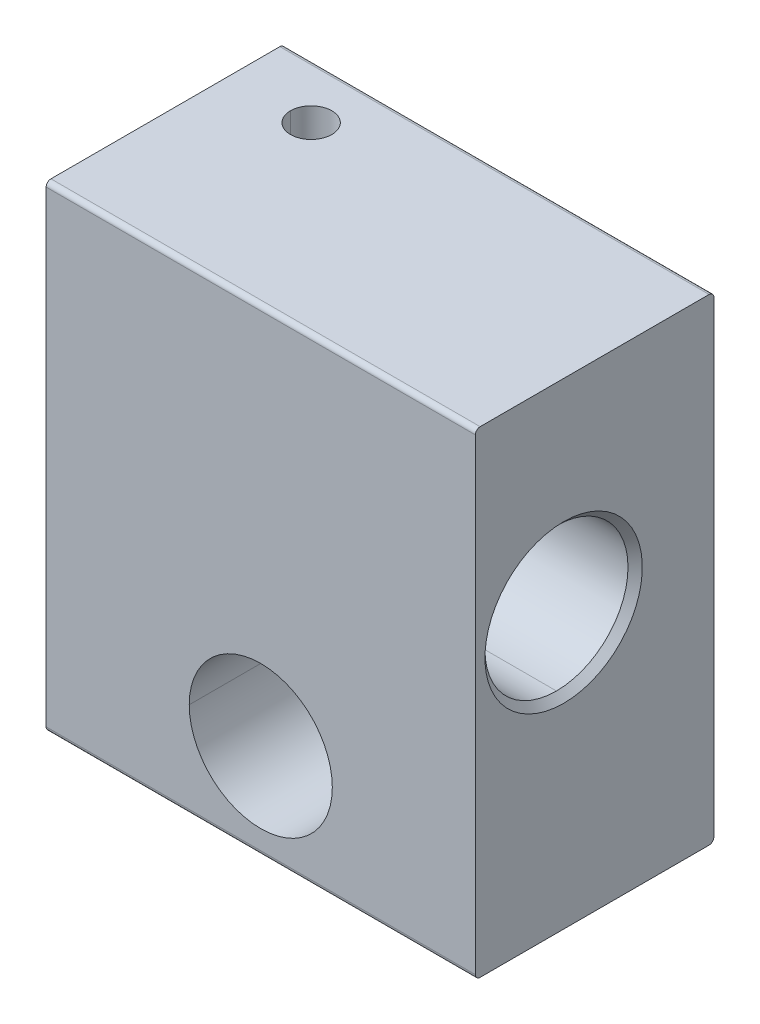
ISO-10303-21;
HEADER;
FILE_DESCRIPTION(('STEP AP214'),'2;1');
FILE_NAME('part.step','',(''),(''),'','','');
FILE_SCHEMA(('AUTOMOTIVE_DESIGN { 1 0 10303 214 1 1 1 1 }'));
ENDSEC;
DATA;
#1=APPLICATION_CONTEXT('core data for automotive mechanical design processes');
#2=APPLICATION_PROTOCOL_DEFINITION('international standard','automotive_design',2000,#1);
#3=PRODUCT_CONTEXT('',#1,'mechanical');
#4=PRODUCT('Part','Part','',(#3));
#5=PRODUCT_RELATED_PRODUCT_CATEGORY('part','',(#4));
#6=PRODUCT_DEFINITION_FORMATION('','',#4);
#7=PRODUCT_DEFINITION_CONTEXT('part definition',#1,'design');
#8=PRODUCT_DEFINITION('design','',#6,#7);
#9=PRODUCT_DEFINITION_SHAPE('','',#8);
#10=(LENGTH_UNIT() NAMED_UNIT(*) SI_UNIT(.MILLI.,.METRE.));
#11=(NAMED_UNIT(*) PLANE_ANGLE_UNIT() SI_UNIT($,.RADIAN.));
#12=(NAMED_UNIT(*) SI_UNIT($,.STERADIAN.) SOLID_ANGLE_UNIT());
#13=UNCERTAINTY_MEASURE_WITH_UNIT(LENGTH_MEASURE(1.E-05),#10,'distance_accuracy_value','');
#14=(GEOMETRIC_REPRESENTATION_CONTEXT(3) GLOBAL_UNCERTAINTY_ASSIGNED_CONTEXT((#13)) GLOBAL_UNIT_ASSIGNED_CONTEXT((#10,
#11,#12)) REPRESENTATION_CONTEXT('',''));
#15=CARTESIAN_POINT('',(0.,0.,0.));
#16=DIRECTION('',(0.,0.,1.));
#17=DIRECTION('',(1.,0.,0.));
#18=AXIS2_PLACEMENT_3D('',#15,#16,#17);
#19=CARTESIAN_POINT('',(0.,0.,0.));
#20=DIRECTION('',(-1.,0.,0.));
#21=DIRECTION('',(0.,0.,1.));
#22=AXIS2_PLACEMENT_3D('',#19,#20,#21);
#23=PLANE('',#22);
#24=CARTESIAN_POINT('',(0.,4.75,-2.75));
#25=DIRECTION('',(-1.,0.,0.));
#26=DIRECTION('',(0.,0.,1.));
#27=AXIS2_PLACEMENT_3D('',#24,#25,#26);
#28=CIRCLE('',#27,1.75);
#29=CARTESIAN_POINT('',(0.,3.,-2.75));
#30=VERTEX_POINT('',#29);
#31=CARTESIAN_POINT('',(0.,6.5,-2.75));
#32=VERTEX_POINT('',#31);
#33=EDGE_CURVE('E94',#30,#32,#28,.T.);
#34=ORIENTED_EDGE('',*,*,#33,.T.);
#35=CARTESIAN_POINT('',(0.,4.75,-2.75));
#36=DIRECTION('',(-1.,0.,0.));
#37=DIRECTION('',(0.,0.,1.));
#38=AXIS2_PLACEMENT_3D('',#35,#36,#37);
#39=CIRCLE('',#38,1.75);
#40=EDGE_CURVE('E19',#32,#30,#39,.T.);
#41=ORIENTED_EDGE('',*,*,#40,.T.);
#42=EDGE_LOOP('',(#34,#41));
#43=FACE_BOUND('',#42,.T.);
#44=ADVANCED_FACE('F16',(#43),#23,.T.);
#45=CARTESIAN_POINT('',(-5.58374404907,8.5,-2.69599699974));
#46=DIRECTION('',(0.,1.,0.));
#47=DIRECTION('',(0.,0.,1.));
#48=AXIS2_PLACEMENT_3D('',#45,#46,#47);
#49=CYLINDRICAL_SURFACE('',#48,0.865463381036001);
#50=CARTESIAN_POINT('',(-5.58374404907,10.,-2.69599699974));
#51=DIRECTION('',(0.,1.,0.));
#52=DIRECTION('',(0.,0.,1.));
#53=AXIS2_PLACEMENT_3D('',#50,#51,#52);
#54=CIRCLE('',#53,0.865463381036001);
#55=CARTESIAN_POINT('',(-4.718280668034,10.,-2.69599699974));
#56=VERTEX_POINT('',#55);
#57=CARTESIAN_POINT('',(-6.449207430106,10.,-2.69599699974));
#58=VERTEX_POINT('',#57);
#59=EDGE_CURVE('E337',#56,#58,#54,.F.);
#60=ORIENTED_EDGE('',*,*,#59,.F.);
#61=DIRECTION('',(0.,1.,0.));
#62=VECTOR('',#61,1.);
#63=CARTESIAN_POINT('',(-4.718280668034,8.5,-2.69599699974));
#64=LINE('',#63,#62);
#65=CARTESIAN_POINT('',(-4.718280668034,6.49916656610024,-2.69599699974));
#66=VERTEX_POINT('',#65);
#67=EDGE_CURVE('E97',#56,#66,#64,.F.);
#68=ORIENTED_EDGE('',*,*,#67,.T.);
#69=CARTESIAN_POINT('',(-4.718280668034,6.49916656610024,-2.69599699973999));
#70=CARTESIAN_POINT('',(-4.71827943985759,6.49845655097241,-2.67292182099926));
#71=CARTESIAN_POINT('',(-4.71920411259253,6.49728503233129,-2.64987367380699));
#72=CARTESIAN_POINT('',(-4.72287699952676,6.49404997235712,-2.60399651028475));
#73=CARTESIAN_POINT('',(-4.72562438370819,6.49198683719326,-2.58116739900928));
#74=CARTESIAN_POINT('',(-4.73651912291083,6.48453247037654,-2.51347550934982));
#75=CARTESIAN_POINT('',(-4.74731977786135,6.47786768245767,-2.46914908072299));
#76=CARTESIAN_POINT('',(-4.77548044790523,6.46170745957908,-2.38329950976342));
#77=CARTESIAN_POINT('',(-4.79283137293478,6.45221595120516,-2.34177257615918));
#78=CARTESIAN_POINT('',(-4.83347666370518,6.4311633827718,-2.26226744059566));
#79=CARTESIAN_POINT('',(-4.85677745708186,6.41960008862066,-2.22429313754469));
#80=CARTESIAN_POINT('',(-4.91040224799477,6.39450642952981,-2.15022727414583));
#81=CARTESIAN_POINT('',(-4.94108809334865,6.3808966283461,-2.11442506720218));
#82=CARTESIAN_POINT('',(-5.0078334622717,6.35354087503287,-2.04825894713925));
#83=CARTESIAN_POINT('',(-5.04389677373725,6.33979483335879,-2.01789890095397));
#84=CARTESIAN_POINT('',(-5.12366654268542,6.31248489694969,-1.96120080381119));
#85=CARTESIAN_POINT('',(-5.16774349124281,6.29901209661236,-1.93533560531659));
#86=CARTESIAN_POINT('',(-5.260456350065,6.27518575498728,-1.89155126025869));
#87=CARTESIAN_POINT('',(-5.30908779094872,6.26482919688799,-1.87362442064382));
#88=CARTESIAN_POINT('',(-5.40572670409971,6.24950925722893,-1.84767814767192));
#89=CARTESIAN_POINT('',(-5.45350234755153,6.24419674406619,-1.83901104649476));
#90=CARTESIAN_POINT('',(-5.55010303363298,6.23856429933694,-1.82983179226393));
#91=CARTESIAN_POINT('',(-5.59892693345706,6.23823918228851,-1.82931116916492));
#92=CARTESIAN_POINT('',(-5.68934247917654,6.24232892476596,-1.83596385934772));
#93=CARTESIAN_POINT('',(-5.7310418932132,6.24612693211075,-1.84213577476799));
#94=CARTESIAN_POINT('',(-5.81269822193081,6.25701011768202,-1.86031927110512));
#95=CARTESIAN_POINT('',(-5.85265454883583,6.26409639549516,-1.87233280550426));
#96=CARTESIAN_POINT('',(-5.93113801571533,6.28100777088332,-1.90216994970125));
#97=CARTESIAN_POINT('',(-5.96958530472741,6.29090926670676,-1.92015839450377));
#98=CARTESIAN_POINT('',(-6.04310709443293,6.31236357908372,-1.96129360061175));
#99=CARTESIAN_POINT('',(-6.07817998353493,6.32391717818621,-1.98444280932911));
#100=CARTESIAN_POINT('',(-6.14916431468627,6.34939122761223,-2.03903116945159));
#101=CARTESIAN_POINT('',(-6.18449516873013,6.36341555500456,-2.07117927220706));
#102=CARTESIAN_POINT('',(-6.24950297432675,6.39102939480264,-2.14095890432198));
#103=CARTESIAN_POINT('',(-6.27917616163013,6.40461861274694,-2.17859405523536));
#104=CARTESIAN_POINT('',(-6.33367811695398,6.43088475313016,-2.26101772778807));
#105=CARTESIAN_POINT('',(-6.35811963133922,6.44346110636437,-2.30609668365785));
#106=CARTESIAN_POINT('',(-6.39880878153456,6.4654230167359,-2.40048723676003));
#107=CARTESIAN_POINT('',(-6.4150720446331,6.47481464807621,-2.44979054922285));
#108=CARTESIAN_POINT('',(-6.43420691693743,6.48669977289658,-2.53225726691068));
#109=CARTESIAN_POINT('',(-6.43980802282136,6.49045981818029,-2.56462726802607));
#110=CARTESIAN_POINT('',(-6.4473151302969,6.49619092618795,-2.62997690740586));
#111=CARTESIAN_POINT('',(-6.4492177637001,6.49816035733688,-2.66295707378389));
#112=CARTESIAN_POINT('',(-6.449207430106,6.49916656610024,-2.69599699973999));
#113=B_SPLINE_CURVE_WITH_KNOTS('',3,(#69,#70,#71,#72,#73,#74,#75,#76,#77,#78,#79,#80,#81,#82,
#83,#84,#85,#86,#87,#88,#89,#90,#91,#92,#93,#94,#95,#96,#97,#98,#99,#100,#101,#102,#103,#104,
#105,#106,#107,#108,#109,#110,#111,#112),.UNSPECIFIED.,.F.,.F.,(4,2,2,2,2,2,2,2,2,2,2,2,2,2,2,2,
2,2,2,2,2,4),(0.,0.0692107903510383,0.138390085427228,0.275981759084863,0.413383189178534,
0.550933686529749,0.697556058206491,0.844282203145455,1.00202012277205,1.1596048424815,
1.30525148708201,1.4507466900734,1.57713530414837,1.70356621264412,1.83382348076311,
1.9641426532663,2.1128589834801,2.2616739173606,2.41923574987208,2.57649535266679,
2.67544895400181,2.7744926299595),.UNSPECIFIED.);
#114=CARTESIAN_POINT('',(-6.449207430106,6.49916656610024,-2.69599699974));
#115=VERTEX_POINT('',#114);
#116=EDGE_CURVE('E362',#66,#115,#113,.T.);
#117=ORIENTED_EDGE('',*,*,#116,.T.);
#118=DIRECTION('',(0.,1.,0.));
#119=VECTOR('',#118,1.);
#120=CARTESIAN_POINT('',(-6.449207430106,8.5,-2.69599699974));
#121=LINE('',#120,#119);
#122=EDGE_CURVE('E351',#115,#58,#121,.T.);
#123=ORIENTED_EDGE('',*,*,#122,.T.);
#124=EDGE_LOOP('',(#60,#68,#117,#123));
#125=FACE_BOUND('',#124,.T.);
#126=ADVANCED_FACE('F361',(#125),#49,.F.);
#127=CARTESIAN_POINT('',(-5.58374404907,8.5,-2.69599699974));
#128=DIRECTION('',(0.,1.,0.));
#129=DIRECTION('',(0.,0.,1.));
#130=AXIS2_PLACEMENT_3D('',#127,#128,#129);
#131=CYLINDRICAL_SURFACE('',#130,0.865463381036001);
#132=CARTESIAN_POINT('',(-5.58374404907,10.,-2.69599699974));
#133=DIRECTION('',(0.,1.,0.));
#134=DIRECTION('',(0.,0.,1.));
#135=AXIS2_PLACEMENT_3D('',#132,#133,#134);
#136=CIRCLE('',#135,0.865463381036001);
#137=EDGE_CURVE('E219',#58,#56,#136,.F.);
#138=ORIENTED_EDGE('',*,*,#137,.F.);
#139=ORIENTED_EDGE('',*,*,#122,.F.);
#140=CARTESIAN_POINT('',(-6.449207430106,6.49916656610024,-2.69599699973999));
#141=CARTESIAN_POINT('',(-6.44920742855097,6.49944450456756,-2.70500413194904));
#142=CARTESIAN_POINT('',(-6.44906688802014,6.4996529266262,-2.7140079480752));
#143=CARTESIAN_POINT('',(-6.44850472900686,6.49993073792612,-2.73200894816179));
#144=CARTESIAN_POINT('',(-6.44808311052442,6.5000001271674,-2.74100613212221));
#145=CARTESIAN_POINT('',(-6.44752095306617,6.5,-2.74999999999976));
#146=B_SPLINE_CURVE_WITH_KNOTS('',3,(#140,#141,#142,#143,#144,#145),.UNSPECIFIED.,.F.,.F.,(4,2,
4),(0.,0.0270219737632673,0.0540439475265347),.UNSPECIFIED.);
#147=CARTESIAN_POINT('',(-6.44752095306616,6.5,-2.74999999999988));
#148=VERTEX_POINT('',#147);
#149=EDGE_CURVE('E350',#115,#148,#146,.T.);
#150=ORIENTED_EDGE('',*,*,#149,.T.);
#151=CARTESIAN_POINT('',(-6.44752095306617,6.5,-2.74999999999976));
#152=CARTESIAN_POINT('',(-6.44608499119854,6.50000234791553,-2.77298738908389));
#153=CARTESIAN_POINT('',(-6.443729202422,6.49954659990503,-2.79590453823115));
#154=CARTESIAN_POINT('',(-6.43720943420083,6.49775774755735,-2.84143555949741));
#155=CARTESIAN_POINT('',(-6.4330462475699,6.49642502777113,-2.86404956011377));
#156=CARTESIAN_POINT('',(-6.41794316583485,6.49118755453132,-2.93098579974925));
#157=CARTESIAN_POINT('',(-6.40437379506033,6.48604264705429,-2.97464896877854));
#158=CARTESIAN_POINT('',(-6.37077041588624,6.47305574249458,-3.05886609007516));
#159=CARTESIAN_POINT('',(-6.3507447126859,6.46521720954837,-3.09942395439818));
#160=CARTESIAN_POINT('',(-6.30484942666627,6.44765033765875,-3.17667856192183));
#161=CARTESIAN_POINT('',(-6.27897366643595,6.43792000258495,-3.21337116308956));
#162=CARTESIAN_POINT('',(-6.22032450614174,6.41689297300402,-3.28424332221582));
#163=CARTESIAN_POINT('',(-6.1872301473809,6.40553729956533,-3.318139542389));
#164=CARTESIAN_POINT('',(-6.11593047990314,6.38295027183737,-3.38012983513788));
#165=CARTESIAN_POINT('',(-6.0777227062772,6.37171898035105,-3.4082210927265));
#166=CARTESIAN_POINT('',(-5.99463928173323,6.35004467916908,-3.45934661614327));
#167=CARTESIAN_POINT('',(-5.94950837476903,6.33968249113486,-3.48200376541431));
#168=CARTESIAN_POINT('',(-5.85548099018822,6.32200271692188,-3.51924459552502));
#169=CARTESIAN_POINT('',(-5.80658797578282,6.31468236938984,-3.53383560272386));
#170=CARTESIAN_POINT('',(-5.7101585581989,6.30467764506606,-3.55348715605676));
#171=CARTESIAN_POINT('',(-5.66277840558076,6.30169713417676,-3.55915886310602));
#172=CARTESIAN_POINT('',(-5.5676616463772,6.29989016672657,-3.56261677279449));
#173=CARTESIAN_POINT('',(-5.51992522180095,6.30106171695903,-3.56040675906899));
#174=CARTESIAN_POINT('',(-5.42986537629852,6.30707874713818,-3.54877440860031));
#175=CARTESIAN_POINT('',(-5.38743324155996,6.31159452677448,-3.53999862432058));
#176=CARTESIAN_POINT('',(-5.30469316489411,6.32332502693399,-3.51636874623422));
#177=CARTESIAN_POINT('',(-5.2643858513081,6.33054054075741,-3.50151286570834));
#178=CARTESIAN_POINT('',(-5.18478911597517,6.34725471313726,-3.46532662028319));
#179=CARTESIAN_POINT('',(-5.14565034689991,6.35684917688817,-3.44371067131631));
#180=CARTESIAN_POINT('',(-5.07132698516296,6.37706173973901,-3.39487820609002));
#181=CARTESIAN_POINT('',(-5.03614424724104,6.38768031468344,-3.36765907963408));
#182=CARTESIAN_POINT('',(-4.96691940101231,6.41000854652826,-3.30505513896746));
#183=CARTESIAN_POINT('',(-4.93337610764346,6.4217168712868,-3.26911559810233));
#184=CARTESIAN_POINT('',(-4.8726689677731,6.44379244100509,-3.19179390344211));
#185=CARTESIAN_POINT('',(-4.84550807383728,6.45415906428724,-3.15040924443287));
#186=CARTESIAN_POINT('',(-4.79839278205991,6.47235368276291,-3.06304040971933));
#187=CARTESIAN_POINT('',(-4.77845878239699,6.48017448603632,-3.01704367564056));
#188=CARTESIAN_POINT('',(-4.7467960708335,6.49218921085135,-2.9219215234301));
#189=CARTESIAN_POINT('',(-4.7350451285698,6.49639296597189,-2.87280498043758));
#190=CARTESIAN_POINT('',(-4.72585751065751,6.49898183939333,-2.81092831248743));
#191=CARTESIAN_POINT('',(-4.72431708312789,6.49936297721656,-2.7987737672682));
#192=CARTESIAN_POINT('',(-4.72175470015107,6.49987160859066,-2.77441992534719));
#193=CARTESIAN_POINT('',(-4.72073211142132,6.49999941251255,-2.76222070177286));
#194=CARTESIAN_POINT('',(-4.71996714507387,6.5,-2.75000000000038));
#195=B_SPLINE_CURVE_WITH_KNOTS('',3,(#151,#152,#153,#154,#155,#156,#157,#158,#159,#160,#161,
#162,#163,#164,#165,#166,#167,#168,#169,#170,#171,#172,#173,#174,#175,#176,#177,#178,#179,#180,
#181,#182,#183,#184,#185,#186,#187,#188,#189,#190,#191,#192,#193,#194),.UNSPECIFIED.,.F.,.F.,(4,
2,2,2,2,2,2,2,2,2,2,2,2,2,2,2,2,2,2,2,2,4),(0.,0.0690493564871186,0.138068455081051,
0.275375278544628,0.412506175384796,0.549782558606745,0.695304688253115,0.840897220863173,
0.99474617163915,1.14845515309686,1.29108451705809,1.43364542073614,1.56375937832553,
1.69391159916224,1.83054534649486,1.9672428882179,2.11815136498801,2.26912951678498,
2.42053055201548,2.57151866457927,2.60828350194265,2.6450032691053),.UNSPECIFIED.);
#196=CARTESIAN_POINT('',(-4.71996714507387,6.5,-2.75000000000038));
#197=VERTEX_POINT('',#196);
#198=EDGE_CURVE('E96',#148,#197,#195,.T.);
#199=ORIENTED_EDGE('',*,*,#198,.T.);
#200=CARTESIAN_POINT('',(-4.71996714507387,6.5,-2.75000000000038));
#201=CARTESIAN_POINT('',(-4.7194049876156,6.5000001271674,-2.74100613212273));
#202=CARTESIAN_POINT('',(-4.71898336913315,6.49993073792612,-2.73200894816221));
#203=CARTESIAN_POINT('',(-4.71842121011986,6.4996529266262,-2.71400794807541));
#204=CARTESIAN_POINT('',(-4.71828066958903,6.49944450456756,-2.70500413194914));
#205=CARTESIAN_POINT('',(-4.718280668034,6.49916656610024,-2.69599699973999));
#206=B_SPLINE_CURVE_WITH_KNOTS('',3,(#200,#201,#202,#203,#204,#205),.UNSPECIFIED.,.F.,.F.,(4,2,
4),(0.,0.0270219737635793,0.0540439475271581),.UNSPECIFIED.);
#207=EDGE_CURVE('E368',#197,#66,#206,.T.);
#208=ORIENTED_EDGE('',*,*,#207,.T.);
#209=ORIENTED_EDGE('',*,*,#67,.F.);
#210=EDGE_LOOP('',(#138,#139,#150,#199,#208,#209));
#211=FACE_BOUND('',#210,.T.);
#212=ADVANCED_FACE('F373',(#211),#131,.F.);
#213=CARTESIAN_POINT('',(-4.5,4.75,-2.75));
#214=DIRECTION('',(-1.,0.,0.));
#215=DIRECTION('',(0.,0.,1.));
#216=AXIS2_PLACEMENT_3D('',#213,#214,#215);
#217=CYLINDRICAL_SURFACE('',#216,1.75);
#218=DIRECTION('',(-1.,0.,0.));
#219=VECTOR('',#218,1.);
#220=CARTESIAN_POINT('',(-4.5,6.5,-2.75));
#221=LINE('',#220,#219);
#222=CARTESIAN_POINT('',(-8.80000000000594,6.4999999999715,-2.75));
#223=VERTEX_POINT('',#222);
#224=EDGE_CURVE('E116',#148,#223,#221,.T.);
#225=ORIENTED_EDGE('',*,*,#224,.T.);
#226=CARTESIAN_POINT('',(-8.80000000000791,4.75,-2.74999999999999));
#227=DIRECTION('',(-1.,0.,0.));
#228=DIRECTION('',(0.,-1.,0.));
#229=AXIS2_PLACEMENT_3D('',#226,#227,#228);
#230=CIRCLE('',#229,1.74999999995725);
#231=CARTESIAN_POINT('',(-8.80000000000198,3.,-2.75));
#232=VERTEX_POINT('',#231);
#233=EDGE_CURVE('E114',#223,#232,#230,.T.);
#234=ORIENTED_EDGE('',*,*,#233,.T.);
#235=DIRECTION('',(-1.,0.,0.));
#236=VECTOR('',#235,1.);
#237=CARTESIAN_POINT('',(-4.5,3.,-2.75));
#238=LINE('',#237,#236);
#239=EDGE_CURVE('E104',#232,#30,#238,.F.);
#240=ORIENTED_EDGE('',*,*,#239,.T.);
#241=ORIENTED_EDGE('',*,*,#40,.F.);
#242=DIRECTION('',(-1.,0.,0.));
#243=VECTOR('',#242,1.);
#244=CARTESIAN_POINT('',(-4.5,6.5,-2.75));
#245=LINE('',#244,#243);
#246=EDGE_CURVE('E107',#32,#197,#245,.T.);
#247=ORIENTED_EDGE('',*,*,#246,.T.);
#248=ORIENTED_EDGE('',*,*,#198,.F.);
#249=EDGE_LOOP('',(#225,#234,#240,#241,#247,#248));
#250=FACE_BOUND('',#249,.T.);
#251=ADVANCED_FACE('F112',(#250),#217,.F.);
#252=CARTESIAN_POINT('',(-4.5,4.75,-2.75));
#253=DIRECTION('',(-1.,0.,0.));
#254=DIRECTION('',(0.,0.,1.));
#255=AXIS2_PLACEMENT_3D('',#252,#253,#254);
#256=CYLINDRICAL_SURFACE('',#255,1.75);
#257=ORIENTED_EDGE('',*,*,#116,.F.);
#258=ORIENTED_EDGE('',*,*,#207,.F.);
#259=ORIENTED_EDGE('',*,*,#246,.F.);
#260=ORIENTED_EDGE('',*,*,#33,.F.);
#261=ORIENTED_EDGE('',*,*,#239,.F.);
#262=CARTESIAN_POINT('',(-8.80000000000791,4.75,-2.74999999999999));
#263=DIRECTION('',(-1.,0.,0.));
#264=DIRECTION('',(0.,-1.,0.));
#265=AXIS2_PLACEMENT_3D('',#262,#263,#264);
#266=CIRCLE('',#265,1.74999999995725);
#267=EDGE_CURVE('E128',#232,#223,#266,.T.);
#268=ORIENTED_EDGE('',*,*,#267,.T.);
#269=ORIENTED_EDGE('',*,*,#224,.F.);
#270=ORIENTED_EDGE('',*,*,#149,.F.);
#271=EDGE_LOOP('',(#257,#258,#259,#260,#261,#268,#269,#270));
#272=FACE_BOUND('',#271,.T.);
#273=ADVANCED_FACE('F101',(#272),#256,.F.);
#274=CARTESIAN_POINT('',(-1.5,1.5,1.3));
#275=DIRECTION('',(1.,0.,0.));
#276=DIRECTION('',(0.,0.,-1.));
#277=AXIS2_PLACEMENT_3D('',#274,#275,#276);
#278=CYLINDRICAL_SURFACE('',#277,3.);
#279=DIRECTION('',(1.,0.,0.));
#280=VECTOR('',#279,1.);
#281=CARTESIAN_POINT('',(-1.5,4.5,1.3));
#282=LINE('',#281,#280);
#283=CARTESIAN_POINT('',(8.69999999999438,4.49999999998761,1.3));
#284=VERTEX_POINT('',#283);
#285=CARTESIAN_POINT('',(-8.69999999999438,4.50000000000182,1.3));
#286=VERTEX_POINT('',#285);
#287=EDGE_CURVE('E346',#284,#286,#282,.F.);
#288=ORIENTED_EDGE('',*,*,#287,.T.);
#289=CARTESIAN_POINT('',(-8.69999999997617,1.5,1.3));
#290=DIRECTION('',(-1.,0.,0.));
#291=DIRECTION('',(0.,1.,0.));
#292=AXIS2_PLACEMENT_3D('',#289,#290,#291);
#293=CIRCLE('',#292,3.00000000000728);
#294=CARTESIAN_POINT('',(-8.69999999999438,-1.50000000000182,1.3));
#295=VERTEX_POINT('',#294);
#296=EDGE_CURVE('E131',#286,#295,#293,.T.);
#297=ORIENTED_EDGE('',*,*,#296,.T.);
#298=DIRECTION('',(1.,0.,0.));
#299=VECTOR('',#298,1.);
#300=CARTESIAN_POINT('',(-1.5,-1.5,1.3));
#301=LINE('',#300,#299);
#302=CARTESIAN_POINT('',(8.69999999999438,-1.49999999998761,1.3));
#303=VERTEX_POINT('',#302);
#304=EDGE_CURVE('E342',#295,#303,#301,.T.);
#305=ORIENTED_EDGE('',*,*,#304,.T.);
#306=CARTESIAN_POINT('',(8.69999999997617,1.5,1.3));
#307=DIRECTION('',(1.,0.,0.));
#308=DIRECTION('',(0.,1.,0.));
#309=AXIS2_PLACEMENT_3D('',#306,#307,#308);
#310=CIRCLE('',#309,2.99999999995043);
#311=EDGE_CURVE('E333',#303,#284,#310,.T.);
#312=ORIENTED_EDGE('',*,*,#311,.T.);
#313=EDGE_LOOP('',(#288,#297,#305,#312));
#314=FACE_BOUND('',#313,.T.);
#315=ADVANCED_FACE('F393',(#314),#278,.F.);
#316=CARTESIAN_POINT('',(-1.5,1.5,1.3));
#317=DIRECTION('',(1.,0.,0.));
#318=DIRECTION('',(0.,0.,-1.));
#319=AXIS2_PLACEMENT_3D('',#316,#317,#318);
#320=CYLINDRICAL_SURFACE('',#319,3.);
#321=ORIENTED_EDGE('',*,*,#304,.F.);
#322=CARTESIAN_POINT('',(-8.69999999997617,1.5,1.3));
#323=DIRECTION('',(-1.,0.,0.));
#324=DIRECTION('',(0.,1.,0.));
#325=AXIS2_PLACEMENT_3D('',#322,#323,#324);
#326=CIRCLE('',#325,3.00000000000728);
#327=EDGE_CURVE('E218',#295,#286,#326,.T.);
#328=ORIENTED_EDGE('',*,*,#327,.T.);
#329=ORIENTED_EDGE('',*,*,#287,.F.);
#330=CARTESIAN_POINT('',(8.69999999997617,1.5,1.3));
#331=DIRECTION('',(1.,0.,0.));
#332=DIRECTION('',(0.,1.,0.));
#333=AXIS2_PLACEMENT_3D('',#330,#331,#332);
#334=CIRCLE('',#333,2.99999999995043);
#335=EDGE_CURVE('E338',#284,#303,#334,.T.);
#336=ORIENTED_EDGE('',*,*,#335,.T.);
#337=EDGE_LOOP('',(#321,#328,#329,#336));
#338=FACE_BOUND('',#337,.T.);
#339=ADVANCED_FACE('F477',(#338),#320,.F.);
#340=CARTESIAN_POINT('',(8.99999999995771,1.5,1.3));
#341=DIRECTION('',(1.,0.,0.));
#342=DIRECTION('',(0.,0.,-1.));
#343=AXIS2_PLACEMENT_3D('',#340,#341,#342);
#344=CONICAL_SURFACE('',#343,3.29999999993197,0.785398163492187);
#345=ORIENTED_EDGE('',*,*,#335,.F.);
#346=ORIENTED_EDGE('',*,*,#311,.F.);
#347=EDGE_LOOP('',(#345,#346));
#348=FACE_BOUND('',#347,.T.);
#349=CARTESIAN_POINT('',(9.00000000001456,1.5,1.3));
#350=DIRECTION('',(1.,0.,0.));
#351=DIRECTION('',(0.,0.,-1.));
#352=AXIS2_PLACEMENT_3D('',#349,#350,#351);
#353=CIRCLE('',#352,3.29999999998881);
#354=CARTESIAN_POINT('',(9.00000000001456,-1.79999999998881,1.29999999999999));
#355=VERTEX_POINT('',#354);
#356=EDGE_CURVE('E33',#355,#355,#353,.F.);
#357=ORIENTED_EDGE('',*,*,#356,.F.);
#358=EDGE_LOOP('',(#357));
#359=FACE_BOUND('',#358,.T.);
#360=ADVANCED_FACE('F410',(#348,#359),#344,.F.);
#361=CARTESIAN_POINT('',(0.,10.,-5.));
#362=DIRECTION('',(0.,1.,0.));
#363=DIRECTION('',(0.,0.,1.));
#364=AXIS2_PLACEMENT_3D('',#361,#362,#363);
#365=PLANE('',#364);
#366=ORIENTED_EDGE('',*,*,#59,.T.);
#367=ORIENTED_EDGE('',*,*,#137,.T.);
#368=EDGE_LOOP('',(#366,#367));
#369=FACE_BOUND('',#368,.T.);
#370=DIRECTION('',(0.,0.,-1.));
#371=VECTOR('',#370,1.);
#372=CARTESIAN_POINT('',(9.,10.,0.));
#373=LINE('',#372,#371);
#374=CARTESIAN_POINT('',(9.,10.,-4.8));
#375=VERTEX_POINT('',#374);
#376=CARTESIAN_POINT('',(9.,10.,4.8));
#377=VERTEX_POINT('',#376);
#378=EDGE_CURVE('E206',#375,#377,#373,.F.);
#379=ORIENTED_EDGE('',*,*,#378,.F.);
#380=DIRECTION('',(1.,0.,0.));
#381=VECTOR('',#380,1.);
#382=CARTESIAN_POINT('',(0.,10.,-4.8));
#383=LINE('',#382,#381);
#384=CARTESIAN_POINT('',(-9.,10.,-4.8));
#385=VERTEX_POINT('',#384);
#386=EDGE_CURVE('E192',#385,#375,#383,.T.);
#387=ORIENTED_EDGE('',*,*,#386,.F.);
#388=DIRECTION('',(0.,0.,-1.));
#389=VECTOR('',#388,1.);
#390=CARTESIAN_POINT('',(-9.,10.,0.));
#391=LINE('',#390,#389);
#392=CARTESIAN_POINT('',(-9.,10.,4.8));
#393=VERTEX_POINT('',#392);
#394=EDGE_CURVE('E187',#385,#393,#391,.F.);
#395=ORIENTED_EDGE('',*,*,#394,.T.);
#396=DIRECTION('',(1.,0.,0.));
#397=VECTOR('',#396,1.);
#398=CARTESIAN_POINT('',(0.,10.,4.8));
#399=LINE('',#398,#397);
#400=EDGE_CURVE('E135',#377,#393,#399,.F.);
#401=ORIENTED_EDGE('',*,*,#400,.F.);
#402=EDGE_LOOP('',(#379,#387,#395,#401));
#403=FACE_BOUND('',#402,.T.);
#404=ADVANCED_FACE('F406',(#369,#403),#365,.T.);
#405=CARTESIAN_POINT('',(0.,9.8,4.8));
#406=DIRECTION('',(1.,0.,0.));
#407=DIRECTION('',(0.,0.,-1.));
#408=AXIS2_PLACEMENT_3D('',#405,#406,#407);
#409=CYLINDRICAL_SURFACE('',#408,0.2);
#410=CARTESIAN_POINT('',(-9.,9.8,4.8));
#411=DIRECTION('',(1.,0.,0.));
#412=DIRECTION('',(0.,0.,-1.));
#413=AXIS2_PLACEMENT_3D('',#410,#411,#412);
#414=CIRCLE('',#413,0.2);
#415=CARTESIAN_POINT('',(-9.,9.8,5.));
#416=VERTEX_POINT('',#415);
#417=EDGE_CURVE('E183',#393,#416,#414,.T.);
#418=ORIENTED_EDGE('',*,*,#417,.T.);
#419=DIRECTION('',(-1.,0.,0.));
#420=VECTOR('',#419,1.);
#421=CARTESIAN_POINT('',(0.,9.8,5.));
#422=LINE('',#421,#420);
#423=CARTESIAN_POINT('',(9.,9.8,5.));
#424=VERTEX_POINT('',#423);
#425=EDGE_CURVE('E321',#416,#424,#422,.F.);
#426=ORIENTED_EDGE('',*,*,#425,.T.);
#427=CARTESIAN_POINT('',(9.,9.8,4.8));
#428=DIRECTION('',(1.,0.,0.));
#429=DIRECTION('',(0.,0.,-1.));
#430=AXIS2_PLACEMENT_3D('',#427,#428,#429);
#431=CIRCLE('',#430,0.2);
#432=EDGE_CURVE('E203',#377,#424,#431,.T.);
#433=ORIENTED_EDGE('',*,*,#432,.F.);
#434=ORIENTED_EDGE('',*,*,#400,.T.);
#435=EDGE_LOOP('',(#418,#426,#433,#434));
#436=FACE_BOUND('',#435,.T.);
#437=ADVANCED_FACE('F409',(#436),#409,.T.);
#438=CARTESIAN_POINT('',(0.,-9.8,4.8));
#439=DIRECTION('',(1.,0.,0.));
#440=DIRECTION('',(0.,0.,-1.));
#441=AXIS2_PLACEMENT_3D('',#438,#439,#440);
#442=CYLINDRICAL_SURFACE('',#441,0.2);
#443=CARTESIAN_POINT('',(-9.,-9.8,4.8));
#444=DIRECTION('',(1.,0.,0.));
#445=DIRECTION('',(0.,0.,-1.));
#446=AXIS2_PLACEMENT_3D('',#443,#444,#445);
#447=CIRCLE('',#446,0.2);
#448=CARTESIAN_POINT('',(-9.,-9.8,5.));
#449=VERTEX_POINT('',#448);
#450=CARTESIAN_POINT('',(-9.,-10.,4.8));
#451=VERTEX_POINT('',#450);
#452=EDGE_CURVE('E178',#449,#451,#447,.T.);
#453=ORIENTED_EDGE('',*,*,#452,.T.);
#454=DIRECTION('',(1.,0.,0.));
#455=VECTOR('',#454,1.);
#456=CARTESIAN_POINT('',(0.,-10.,4.8));
#457=LINE('',#456,#455);
#458=CARTESIAN_POINT('',(9.,-10.,4.8));
#459=VERTEX_POINT('',#458);
#460=EDGE_CURVE('E217',#459,#451,#457,.F.);
#461=ORIENTED_EDGE('',*,*,#460,.F.);
#462=CARTESIAN_POINT('',(9.,-9.8,4.8));
#463=DIRECTION('',(1.,0.,0.));
#464=DIRECTION('',(0.,0.,-1.));
#465=AXIS2_PLACEMENT_3D('',#462,#463,#464);
#466=CIRCLE('',#465,0.2);
#467=CARTESIAN_POINT('',(9.,-9.8,5.));
#468=VERTEX_POINT('',#467);
#469=EDGE_CURVE('E200',#468,#459,#466,.T.);
#470=ORIENTED_EDGE('',*,*,#469,.F.);
#471=DIRECTION('',(-1.,0.,0.));
#472=VECTOR('',#471,1.);
#473=CARTESIAN_POINT('',(0.,-9.8,5.));
#474=LINE('',#473,#472);
#475=EDGE_CURVE('E308',#468,#449,#474,.T.);
#476=ORIENTED_EDGE('',*,*,#475,.T.);
#477=EDGE_LOOP('',(#453,#461,#470,#476));
#478=FACE_BOUND('',#477,.T.);
#479=ADVANCED_FACE('F455',(#478),#442,.T.);
#480=CARTESIAN_POINT('',(-8.99999999995771,4.75,-2.74999999999999));
#481=DIRECTION('',(-1.,0.,0.));
#482=DIRECTION('',(0.,0.,1.));
#483=AXIS2_PLACEMENT_3D('',#480,#481,#482);
#484=CONICAL_SURFACE('',#483,1.94999999990705,0.785398163539557);
#485=CARTESIAN_POINT('',(-9.00000000001455,4.75,-2.74999999999999));
#486=DIRECTION('',(-1.,0.,0.));
#487=DIRECTION('',(0.,0.,1.));
#488=AXIS2_PLACEMENT_3D('',#485,#486,#487);
#489=CIRCLE('',#488,1.94999999996389);
#490=CARTESIAN_POINT('',(-9.00000000001455,2.80000000003611,-2.74999999999999));
#491=VERTEX_POINT('',#490);
#492=CARTESIAN_POINT('',(-9.00000000001218,3.2610459404123,-1.4908273318217));
#493=VERTEX_POINT('',#492);
#494=EDGE_CURVE('E169',#491,#493,#489,.T.);
#495=ORIENTED_EDGE('',*,*,#494,.T.);
#496=CARTESIAN_POINT('',(-9.00000000000902,3.26104594042398,-1.49082733181154));
#497=CARTESIAN_POINT('',(-8.99053315913737,3.30776563825382,-1.450180602647));
#498=CARTESIAN_POINT('',(-8.98336596608558,3.35516243045887,-1.40975707541655));
#499=CARTESIAN_POINT('',(-8.97380993796382,3.45073318745372,-1.32987914993626));
#500=CARTESIAN_POINT('',(-8.97139172700728,3.49890050439591,-1.29042029441674));
#501=CARTESIAN_POINT('',(-8.97139172700727,3.59602207694701,-1.21248323002389));
#502=CARTESIAN_POINT('',(-8.97380993796381,3.64497633255592,-1.17400502115056));
#503=CARTESIAN_POINT('',(-8.9833659660858,3.74365682983458,-1.09800231048547));
#504=CARTESIAN_POINT('',(-8.99053315913785,3.79338598321188,-1.06048526410046));
#505=CARTESIAN_POINT('',(-9.00000000001001,3.843186397845,-1.0236775820293));
#506=B_SPLINE_CURVE_WITH_KNOTS('',3,(#496,#497,#498,#499,#500,#501,#502,#503,#504,#505),
.UNSPECIFIED.,.F.,.F.,(4,2,2,2,4),(0.,0.187911721685883,0.374657365916176,0.561403010146515,
0.749314731832443),.UNSPECIFIED.);
#507=CARTESIAN_POINT('',(-9.00000000001455,3.84318639785216,-1.02367758202042));
#508=VERTEX_POINT('',#507);
#509=EDGE_CURVE('E207',#493,#508,#506,.T.);
#510=ORIENTED_EDGE('',*,*,#509,.T.);
#511=CARTESIAN_POINT('',(-9.00000000001455,4.75,-2.74999999999999));
#512=DIRECTION('',(-1.,0.,0.));
#513=DIRECTION('',(0.,0.,1.));
#514=AXIS2_PLACEMENT_3D('',#511,#512,#513);
#515=CIRCLE('',#514,1.94999999996389);
#516=EDGE_CURVE('E173',#508,#491,#515,.T.);
#517=ORIENTED_EDGE('',*,*,#516,.T.);
#518=EDGE_LOOP('',(#495,#510,#517));
#519=FACE_BOUND('',#518,.T.);
#520=ORIENTED_EDGE('',*,*,#233,.F.);
#521=ORIENTED_EDGE('',*,*,#267,.F.);
#522=EDGE_LOOP('',(#520,#521));
#523=FACE_BOUND('',#522,.T.);
#524=ADVANCED_FACE('F221',(#519,#523),#484,.F.);
#525=CARTESIAN_POINT('',(-9.00000000001456,1.5,1.3));
#526=DIRECTION('',(-1.,0.,0.));
#527=DIRECTION('',(0.,0.,1.));
#528=AXIS2_PLACEMENT_3D('',#525,#526,#527);
#529=CONICAL_SURFACE('',#528,3.30000000004566,0.785398163397447);
#530=CARTESIAN_POINT('',(-9.00000000001456,1.5,1.3));
#531=DIRECTION('',(-1.,0.,0.));
#532=DIRECTION('',(0.,0.,1.));
#533=AXIS2_PLACEMENT_3D('',#530,#531,#532);
#534=CIRCLE('',#533,3.30000000004566);
#535=CARTESIAN_POINT('',(-9.00000000001456,-1.80000000004566,1.3));
#536=VERTEX_POINT('',#535);
#537=EDGE_CURVE('E165',#493,#536,#534,.T.);
#538=ORIENTED_EDGE('',*,*,#537,.T.);
#539=CARTESIAN_POINT('',(-9.00000000001456,1.5,1.3));
#540=DIRECTION('',(-1.,0.,0.));
#541=DIRECTION('',(0.,0.,1.));
#542=AXIS2_PLACEMENT_3D('',#539,#540,#541);
#543=CIRCLE('',#542,3.30000000004566);
#544=EDGE_CURVE('E161',#536,#508,#543,.T.);
#545=ORIENTED_EDGE('',*,*,#544,.T.);
#546=ORIENTED_EDGE('',*,*,#509,.F.);
#547=EDGE_LOOP('',(#538,#545,#546));
#548=FACE_BOUND('',#547,.T.);
#549=ORIENTED_EDGE('',*,*,#296,.F.);
#550=ORIENTED_EDGE('',*,*,#327,.F.);
#551=EDGE_LOOP('',(#549,#550));
#552=FACE_BOUND('',#551,.T.);
#553=ADVANCED_FACE('F224',(#548,#552),#529,.F.);
#554=CARTESIAN_POINT('',(0.,-10.,5.));
#555=DIRECTION('',(0.,-1.,0.));
#556=DIRECTION('',(0.,0.,-1.));
#557=AXIS2_PLACEMENT_3D('',#554,#555,#556);
#558=PLANE('',#557);
#559=DIRECTION('',(0.,0.,-1.));
#560=VECTOR('',#559,1.);
#561=CARTESIAN_POINT('',(-9.,-10.,0.));
#562=LINE('',#561,#560);
#563=CARTESIAN_POINT('',(-9.,-10.,-4.8));
#564=VERTEX_POINT('',#563);
#565=EDGE_CURVE('E177',#451,#564,#562,.T.);
#566=ORIENTED_EDGE('',*,*,#565,.T.);
#567=DIRECTION('',(1.,0.,0.));
#568=VECTOR('',#567,1.);
#569=CARTESIAN_POINT('',(0.,-10.,-4.8));
#570=LINE('',#569,#568);
#571=CARTESIAN_POINT('',(9.,-10.,-4.8));
#572=VERTEX_POINT('',#571);
#573=EDGE_CURVE('E156',#572,#564,#570,.F.);
#574=ORIENTED_EDGE('',*,*,#573,.F.);
#575=DIRECTION('',(0.,0.,-1.));
#576=VECTOR('',#575,1.);
#577=CARTESIAN_POINT('',(9.,-10.,0.));
#578=LINE('',#577,#576);
#579=EDGE_CURVE('E199',#459,#572,#578,.T.);
#580=ORIENTED_EDGE('',*,*,#579,.F.);
#581=ORIENTED_EDGE('',*,*,#460,.T.);
#582=EDGE_LOOP('',(#566,#574,#580,#581));
#583=FACE_BOUND('',#582,.T.);
#584=ADVANCED_FACE('F228',(#583),#558,.T.);
#585=CARTESIAN_POINT('',(0.,-10.,5.));
#586=DIRECTION('',(0.,0.,-1.));
#587=DIRECTION('',(-1.,0.,0.));
#588=AXIS2_PLACEMENT_3D('',#585,#586,#587);
#589=PLANE('',#588);
#590=CARTESIAN_POINT('',(0.,-6.,5.));
#591=DIRECTION('',(0.,0.,1.));
#592=DIRECTION('',(1.,0.,0.));
#593=AXIS2_PLACEMENT_3D('',#590,#591,#592);
#594=CIRCLE('',#593,3.);
#595=CARTESIAN_POINT('',(-3.,-6.,5.));
#596=VERTEX_POINT('',#595);
#597=CARTESIAN_POINT('',(3.,-6.,5.));
#598=VERTEX_POINT('',#597);
#599=EDGE_CURVE('E148',#596,#598,#594,.F.);
#600=ORIENTED_EDGE('',*,*,#599,.T.);
#601=CARTESIAN_POINT('',(0.,-6.,5.));
#602=DIRECTION('',(0.,0.,1.));
#603=DIRECTION('',(1.,0.,0.));
#604=AXIS2_PLACEMENT_3D('',#601,#602,#603);
#605=CIRCLE('',#604,3.);
#606=EDGE_CURVE('E142',#598,#596,#605,.F.);
#607=ORIENTED_EDGE('',*,*,#606,.T.);
#608=EDGE_LOOP('',(#600,#607));
#609=FACE_BOUND('',#608,.T.);
#610=DIRECTION('',(0.,1.,0.));
#611=VECTOR('',#610,1.);
#612=CARTESIAN_POINT('',(9.,0.,5.));
#613=LINE('',#612,#611);
#614=EDGE_CURVE('E202',#424,#468,#613,.F.);
#615=ORIENTED_EDGE('',*,*,#614,.F.);
#616=ORIENTED_EDGE('',*,*,#425,.F.);
#617=DIRECTION('',(0.,1.,0.));
#618=VECTOR('',#617,1.);
#619=CARTESIAN_POINT('',(-9.,0.,5.));
#620=LINE('',#619,#618);
#621=EDGE_CURVE('E182',#416,#449,#620,.F.);
#622=ORIENTED_EDGE('',*,*,#621,.T.);
#623=ORIENTED_EDGE('',*,*,#475,.F.);
#624=EDGE_LOOP('',(#615,#616,#622,#623));
#625=FACE_BOUND('',#624,.T.);
#626=ADVANCED_FACE('F232',(#609,#625),#589,.F.);
#627=CARTESIAN_POINT('',(9.,0.,0.));
#628=DIRECTION('',(1.,0.,0.));
#629=DIRECTION('',(0.,0.,-1.));
#630=AXIS2_PLACEMENT_3D('',#627,#628,#629);
#631=PLANE('',#630);
#632=ORIENTED_EDGE('',*,*,#356,.T.);
#633=EDGE_LOOP('',(#632));
#634=FACE_BOUND('',#633,.T.);
#635=ORIENTED_EDGE('',*,*,#579,.T.);
#636=CARTESIAN_POINT('',(9.,-9.8,-4.8));
#637=DIRECTION('',(1.,0.,0.));
#638=DIRECTION('',(0.,0.,-1.));
#639=AXIS2_PLACEMENT_3D('',#636,#637,#638);
#640=CIRCLE('',#639,0.2);
#641=CARTESIAN_POINT('',(9.,-9.8,-5.));
#642=VERTEX_POINT('',#641);
#643=EDGE_CURVE('E157',#642,#572,#640,.F.);
#644=ORIENTED_EDGE('',*,*,#643,.F.);
#645=DIRECTION('',(0.,1.,0.));
#646=VECTOR('',#645,1.);
#647=CARTESIAN_POINT('',(9.,10.,-5.));
#648=LINE('',#647,#646);
#649=CARTESIAN_POINT('',(9.,9.8,-5.));
#650=VERTEX_POINT('',#649);
#651=EDGE_CURVE('E291',#642,#650,#648,.T.);
#652=ORIENTED_EDGE('',*,*,#651,.T.);
#653=CARTESIAN_POINT('',(9.,9.8,-4.8));
#654=DIRECTION('',(1.,0.,0.));
#655=DIRECTION('',(0.,0.,-1.));
#656=AXIS2_PLACEMENT_3D('',#653,#654,#655);
#657=CIRCLE('',#656,0.2);
#658=EDGE_CURVE('E193',#375,#650,#657,.F.);
#659=ORIENTED_EDGE('',*,*,#658,.F.);
#660=ORIENTED_EDGE('',*,*,#378,.T.);
#661=ORIENTED_EDGE('',*,*,#432,.T.);
#662=ORIENTED_EDGE('',*,*,#614,.T.);
#663=ORIENTED_EDGE('',*,*,#469,.T.);
#664=EDGE_LOOP('',(#635,#644,#652,#659,#660,#661,#662,#663));
#665=FACE_BOUND('',#664,.T.);
#666=ADVANCED_FACE('F236',(#634,#665),#631,.T.);
#667=CARTESIAN_POINT('',(0.,9.8,-4.8));
#668=DIRECTION('',(1.,0.,0.));
#669=DIRECTION('',(0.,0.,-1.));
#670=AXIS2_PLACEMENT_3D('',#667,#668,#669);
#671=CYLINDRICAL_SURFACE('',#670,0.2);
#672=CARTESIAN_POINT('',(-9.,9.8,-4.8));
#673=DIRECTION('',(1.,0.,0.));
#674=DIRECTION('',(0.,0.,-1.));
#675=AXIS2_PLACEMENT_3D('',#672,#673,#674);
#676=CIRCLE('',#675,0.2);
#677=CARTESIAN_POINT('',(-9.,9.8,-5.));
#678=VERTEX_POINT('',#677);
#679=EDGE_CURVE('E188',#678,#385,#676,.T.);
#680=ORIENTED_EDGE('',*,*,#679,.T.);
#681=ORIENTED_EDGE('',*,*,#386,.T.);
#682=ORIENTED_EDGE('',*,*,#658,.T.);
#683=DIRECTION('',(1.,0.,0.));
#684=VECTOR('',#683,1.);
#685=CARTESIAN_POINT('',(0.,9.8,-5.));
#686=LINE('',#685,#684);
#687=EDGE_CURVE('E277',#650,#678,#686,.F.);
#688=ORIENTED_EDGE('',*,*,#687,.T.);
#689=EDGE_LOOP('',(#680,#681,#682,#688));
#690=FACE_BOUND('',#689,.T.);
#691=ADVANCED_FACE('F240',(#690),#671,.T.);
#692=CARTESIAN_POINT('',(-9.,0.,0.));
#693=DIRECTION('',(1.,0.,0.));
#694=DIRECTION('',(0.,0.,-1.));
#695=AXIS2_PLACEMENT_3D('',#692,#693,#694);
#696=PLANE('',#695);
#697=ORIENTED_EDGE('',*,*,#537,.F.);
#698=ORIENTED_EDGE('',*,*,#494,.F.);
#699=ORIENTED_EDGE('',*,*,#516,.F.);
#700=ORIENTED_EDGE('',*,*,#544,.F.);
#701=EDGE_LOOP('',(#697,#698,#699,#700));
#702=FACE_BOUND('',#701,.T.);
#703=ORIENTED_EDGE('',*,*,#565,.F.);
#704=ORIENTED_EDGE('',*,*,#452,.F.);
#705=ORIENTED_EDGE('',*,*,#621,.F.);
#706=ORIENTED_EDGE('',*,*,#417,.F.);
#707=ORIENTED_EDGE('',*,*,#394,.F.);
#708=ORIENTED_EDGE('',*,*,#679,.F.);
#709=DIRECTION('',(0.,1.,0.));
#710=VECTOR('',#709,1.);
#711=CARTESIAN_POINT('',(-9.,10.,-5.));
#712=LINE('',#711,#710);
#713=CARTESIAN_POINT('',(-9.,-9.8,-5.));
#714=VERTEX_POINT('',#713);
#715=EDGE_CURVE('E274',#678,#714,#712,.F.);
#716=ORIENTED_EDGE('',*,*,#715,.T.);
#717=CARTESIAN_POINT('',(-9.,-9.8,-4.8));
#718=DIRECTION('',(1.,0.,0.));
#719=DIRECTION('',(0.,0.,-1.));
#720=AXIS2_PLACEMENT_3D('',#717,#718,#719);
#721=CIRCLE('',#720,0.2);
#722=EDGE_CURVE('E152',#564,#714,#721,.T.);
#723=ORIENTED_EDGE('',*,*,#722,.F.);
#724=EDGE_LOOP('',(#703,#704,#705,#706,#707,#708,#716,#723));
#725=FACE_BOUND('',#724,.T.);
#726=ADVANCED_FACE('F243',(#702,#725),#696,.F.);
#727=CARTESIAN_POINT('',(0.,-9.8,-4.8));
#728=DIRECTION('',(1.,0.,0.));
#729=DIRECTION('',(0.,0.,-1.));
#730=AXIS2_PLACEMENT_3D('',#727,#728,#729);
#731=CYLINDRICAL_SURFACE('',#730,0.2);
#732=ORIENTED_EDGE('',*,*,#722,.T.);
#733=DIRECTION('',(1.,0.,0.));
#734=VECTOR('',#733,1.);
#735=CARTESIAN_POINT('',(0.,-9.8,-5.));
#736=LINE('',#735,#734);
#737=EDGE_CURVE('E141',#714,#642,#736,.T.);
#738=ORIENTED_EDGE('',*,*,#737,.T.);
#739=ORIENTED_EDGE('',*,*,#643,.T.);
#740=ORIENTED_EDGE('',*,*,#573,.T.);
#741=EDGE_LOOP('',(#732,#738,#739,#740));
#742=FACE_BOUND('',#741,.T.);
#743=ADVANCED_FACE('F247',(#742),#731,.T.);
#744=CARTESIAN_POINT('',(0.,-6.,0.));
#745=DIRECTION('',(0.,0.,1.));
#746=DIRECTION('',(1.,0.,0.));
#747=AXIS2_PLACEMENT_3D('',#744,#745,#746);
#748=CYLINDRICAL_SURFACE('',#747,3.);
#749=ORIENTED_EDGE('',*,*,#599,.F.);
#750=DIRECTION('',(0.,0.,1.));
#751=VECTOR('',#750,1.);
#752=CARTESIAN_POINT('',(-3.,-6.,0.));
#753=LINE('',#752,#751);
#754=CARTESIAN_POINT('',(-3.,-6.,-5.));
#755=VERTEX_POINT('',#754);
#756=EDGE_CURVE('E146',#596,#755,#753,.F.);
#757=ORIENTED_EDGE('',*,*,#756,.T.);
#758=CARTESIAN_POINT('',(0.,-6.,-5.));
#759=DIRECTION('',(0.,0.,1.));
#760=DIRECTION('',(1.,0.,0.));
#761=AXIS2_PLACEMENT_3D('',#758,#759,#760);
#762=CIRCLE('',#761,3.);
#763=CARTESIAN_POINT('',(3.,-6.,-5.));
#764=VERTEX_POINT('',#763);
#765=EDGE_CURVE('E26',#755,#764,#762,.F.);
#766=ORIENTED_EDGE('',*,*,#765,.T.);
#767=DIRECTION('',(0.,0.,1.));
#768=VECTOR('',#767,1.);
#769=CARTESIAN_POINT('',(3.,-6.,0.));
#770=LINE('',#769,#768);
#771=EDGE_CURVE('E147',#764,#598,#770,.T.);
#772=ORIENTED_EDGE('',*,*,#771,.T.);
#773=EDGE_LOOP('',(#749,#757,#766,#772));
#774=FACE_BOUND('',#773,.T.);
#775=ADVANCED_FACE('F251',(#774),#748,.F.);
#776=CARTESIAN_POINT('',(0.,-6.,0.));
#777=DIRECTION('',(0.,0.,1.));
#778=DIRECTION('',(1.,0.,0.));
#779=AXIS2_PLACEMENT_3D('',#776,#777,#778);
#780=CYLINDRICAL_SURFACE('',#779,3.);
#781=ORIENTED_EDGE('',*,*,#606,.F.);
#782=ORIENTED_EDGE('',*,*,#771,.F.);
#783=CARTESIAN_POINT('',(0.,-6.,-5.));
#784=DIRECTION('',(0.,0.,1.));
#785=DIRECTION('',(1.,0.,0.));
#786=AXIS2_PLACEMENT_3D('',#783,#784,#785);
#787=CIRCLE('',#786,3.);
#788=EDGE_CURVE('E11',#764,#755,#787,.F.);
#789=ORIENTED_EDGE('',*,*,#788,.T.);
#790=ORIENTED_EDGE('',*,*,#756,.F.);
#791=EDGE_LOOP('',(#781,#782,#789,#790));
#792=FACE_BOUND('',#791,.T.);
#793=ADVANCED_FACE('F255',(#792),#780,.F.);
#794=CARTESIAN_POINT('',(0.,10.,-5.));
#795=DIRECTION('',(0.,0.,1.));
#796=DIRECTION('',(1.,0.,0.));
#797=AXIS2_PLACEMENT_3D('',#794,#795,#796);
#798=PLANE('',#797);
#799=ORIENTED_EDGE('',*,*,#765,.F.);
#800=ORIENTED_EDGE('',*,*,#788,.F.);
#801=EDGE_LOOP('',(#799,#800));
#802=FACE_BOUND('',#801,.T.);
#803=ORIENTED_EDGE('',*,*,#715,.F.);
#804=ORIENTED_EDGE('',*,*,#687,.F.);
#805=ORIENTED_EDGE('',*,*,#651,.F.);
#806=ORIENTED_EDGE('',*,*,#737,.F.);
#807=EDGE_LOOP('',(#803,#804,#805,#806));
#808=FACE_BOUND('',#807,.T.);
#809=ADVANCED_FACE('F259',(#802,#808),#798,.F.);
#810=CLOSED_SHELL('',(#44,#126,#212,#251,#273,#315,#339,#360,#404,#437,#479,#524,#553,#584,#626,
#666,#691,#726,#743,#775,#793,#809));
#811=MANIFOLD_SOLID_BREP('B1',#810);
#812=ADVANCED_BREP_SHAPE_REPRESENTATION('',(#18,#811),#14);
#813=SHAPE_DEFINITION_REPRESENTATION(#9,#812);
ENDSEC;
END-ISO-10303-21;
